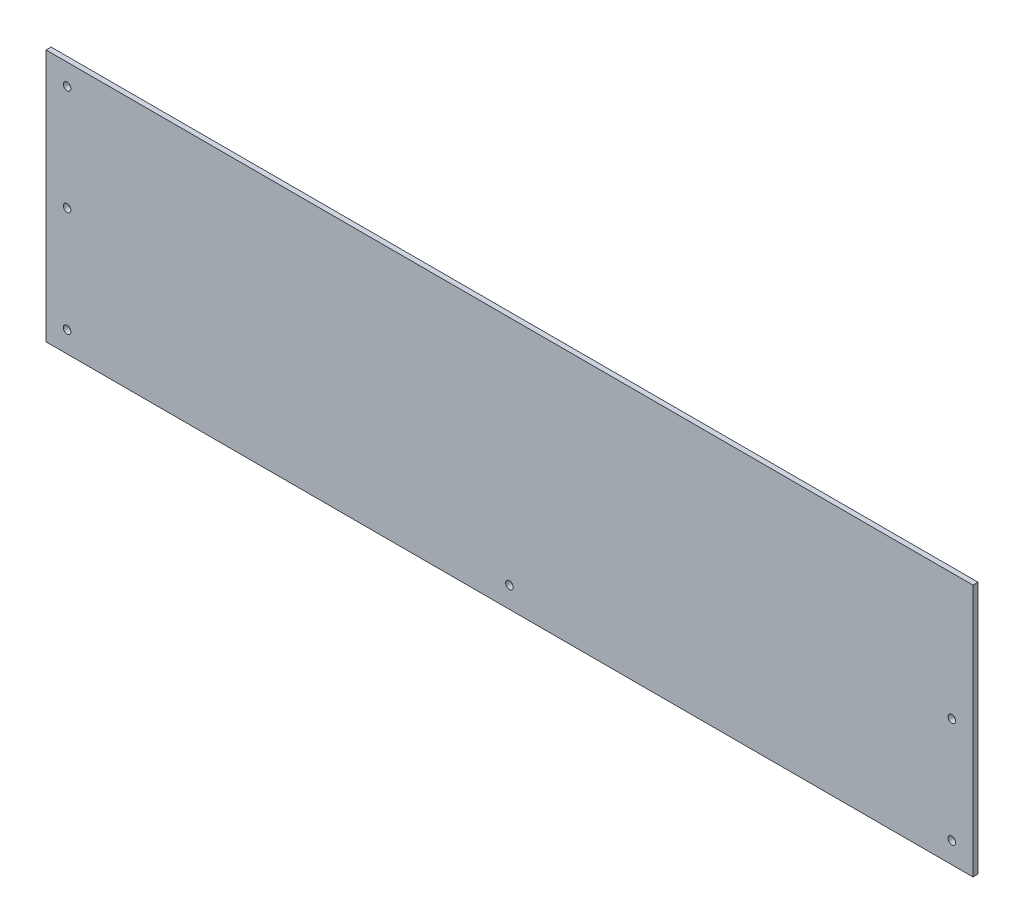
ISO-10303-21;
HEADER;
FILE_DESCRIPTION(('STEP AP214'),'2;1');
FILE_NAME('part.step','',(''),(''),'','','');
FILE_SCHEMA(('AUTOMOTIVE_DESIGN { 1 0 10303 214 1 1 1 1 }'));
ENDSEC;
DATA;
#1=APPLICATION_CONTEXT('core data for automotive mechanical design processes');
#2=APPLICATION_PROTOCOL_DEFINITION('international standard','automotive_design',2000,#1);
#3=PRODUCT_CONTEXT('',#1,'mechanical');
#4=PRODUCT('Part','Part','',(#3));
#5=PRODUCT_RELATED_PRODUCT_CATEGORY('part','',(#4));
#6=PRODUCT_DEFINITION_FORMATION('','',#4);
#7=PRODUCT_DEFINITION_CONTEXT('part definition',#1,'design');
#8=PRODUCT_DEFINITION('design','',#6,#7);
#9=PRODUCT_DEFINITION_SHAPE('','',#8);
#10=(LENGTH_UNIT() NAMED_UNIT(*) SI_UNIT(.MILLI.,.METRE.));
#11=(NAMED_UNIT(*) PLANE_ANGLE_UNIT() SI_UNIT($,.RADIAN.));
#12=(NAMED_UNIT(*) SI_UNIT($,.STERADIAN.) SOLID_ANGLE_UNIT());
#13=UNCERTAINTY_MEASURE_WITH_UNIT(LENGTH_MEASURE(1.E-05),#10,'distance_accuracy_value','');
#14=(GEOMETRIC_REPRESENTATION_CONTEXT(3) GLOBAL_UNCERTAINTY_ASSIGNED_CONTEXT((#13)) GLOBAL_UNIT_ASSIGNED_CONTEXT((#10,
#11,#12)) REPRESENTATION_CONTEXT('',''));
#15=CARTESIAN_POINT('',(0.,0.,0.));
#16=DIRECTION('',(0.,0.,1.));
#17=DIRECTION('',(1.,0.,0.));
#18=AXIS2_PLACEMENT_3D('',#15,#16,#17);
#19=CARTESIAN_POINT('',(0.,0.,3.));
#20=DIRECTION('',(1.,0.,0.));
#21=DIRECTION('',(0.,0.,-1.));
#22=AXIS2_PLACEMENT_3D('',#19,#20,#21);
#23=PLANE('',#22);
#24=DIRECTION('',(0.,-1.,0.));
#25=VECTOR('',#24,1.);
#26=CARTESIAN_POINT('',(0.,0.,0.));
#27=LINE('',#26,#25);
#28=CARTESIAN_POINT('',(0.,150.,0.));
#29=VERTEX_POINT('',#28);
#30=CARTESIAN_POINT('',(0.,0.,0.));
#31=VERTEX_POINT('',#30);
#32=EDGE_CURVE('E96',#29,#31,#27,.T.);
#33=ORIENTED_EDGE('',*,*,#32,.T.);
#34=DIRECTION('',(0.,0.,-1.));
#35=VECTOR('',#34,1.);
#36=CARTESIAN_POINT('',(0.,0.,3.));
#37=LINE('',#36,#35);
#38=CARTESIAN_POINT('',(0.,0.,3.));
#39=VERTEX_POINT('',#38);
#40=EDGE_CURVE('E11',#39,#31,#37,.T.);
#41=ORIENTED_EDGE('',*,*,#40,.F.);
#42=DIRECTION('',(0.,-1.,0.));
#43=VECTOR('',#42,1.);
#44=CARTESIAN_POINT('',(0.,0.,3.));
#45=LINE('',#44,#43);
#46=CARTESIAN_POINT('',(0.,150.,3.));
#47=VERTEX_POINT('',#46);
#48=EDGE_CURVE('E84',#47,#39,#45,.T.);
#49=ORIENTED_EDGE('',*,*,#48,.F.);
#50=DIRECTION('',(0.,0.,-1.));
#51=VECTOR('',#50,1.);
#52=CARTESIAN_POINT('',(0.,150.,3.));
#53=LINE('',#52,#51);
#54=EDGE_CURVE('E92',#47,#29,#53,.T.);
#55=ORIENTED_EDGE('',*,*,#54,.T.);
#56=EDGE_LOOP('',(#33,#41,#49,#55));
#57=FACE_BOUND('',#56,.T.);
#58=ADVANCED_FACE('F33',(#57),#23,.F.);
#59=CARTESIAN_POINT('',(0.,0.,3.));
#60=DIRECTION('',(0.,1.,0.));
#61=DIRECTION('',(0.,0.,1.));
#62=AXIS2_PLACEMENT_3D('',#59,#60,#61);
#63=PLANE('',#62);
#64=DIRECTION('',(1.,0.,0.));
#65=VECTOR('',#64,1.);
#66=CARTESIAN_POINT('',(0.,0.,0.));
#67=LINE('',#66,#65);
#68=CARTESIAN_POINT('',(550.000000000009,0.,0.));
#69=VERTEX_POINT('',#68);
#70=EDGE_CURVE('E88',#31,#69,#67,.T.);
#71=ORIENTED_EDGE('',*,*,#70,.T.);
#72=DIRECTION('',(0.,0.,-1.));
#73=VECTOR('',#72,1.);
#74=CARTESIAN_POINT('',(550.000000000009,0.,3.));
#75=LINE('',#74,#73);
#76=CARTESIAN_POINT('',(550.000000000009,0.,3.));
#77=VERTEX_POINT('',#76);
#78=EDGE_CURVE('E41',#77,#69,#75,.T.);
#79=ORIENTED_EDGE('',*,*,#78,.F.);
#80=DIRECTION('',(1.,0.,0.));
#81=VECTOR('',#80,1.);
#82=CARTESIAN_POINT('',(0.,0.,3.));
#83=LINE('',#82,#81);
#84=EDGE_CURVE('E79',#39,#77,#83,.T.);
#85=ORIENTED_EDGE('',*,*,#84,.F.);
#86=ORIENTED_EDGE('',*,*,#40,.T.);
#87=EDGE_LOOP('',(#71,#79,#85,#86));
#88=FACE_BOUND('',#87,.T.);
#89=ADVANCED_FACE('F87',(#88),#63,.F.);
#90=CARTESIAN_POINT('',(550.000000000009,0.,3.));
#91=DIRECTION('',(-1.,0.,0.));
#92=DIRECTION('',(0.,0.,1.));
#93=AXIS2_PLACEMENT_3D('',#90,#91,#92);
#94=PLANE('',#93);
#95=DIRECTION('',(0.,1.,0.));
#96=VECTOR('',#95,1.);
#97=CARTESIAN_POINT('',(550.000000000009,0.,0.));
#98=LINE('',#97,#96);
#99=CARTESIAN_POINT('',(550.000000000009,150.,0.));
#100=VERTEX_POINT('',#99);
#101=EDGE_CURVE('E66',#69,#100,#98,.T.);
#102=ORIENTED_EDGE('',*,*,#101,.T.);
#103=DIRECTION('',(0.,0.,-1.));
#104=VECTOR('',#103,1.);
#105=CARTESIAN_POINT('',(550.000000000009,150.,3.));
#106=LINE('',#105,#104);
#107=CARTESIAN_POINT('',(550.000000000009,150.,3.));
#108=VERTEX_POINT('',#107);
#109=EDGE_CURVE('E89',#108,#100,#106,.T.);
#110=ORIENTED_EDGE('',*,*,#109,.F.);
#111=DIRECTION('',(0.,1.,0.));
#112=VECTOR('',#111,1.);
#113=CARTESIAN_POINT('',(550.000000000009,0.,3.));
#114=LINE('',#113,#112);
#115=EDGE_CURVE('E82',#77,#108,#114,.T.);
#116=ORIENTED_EDGE('',*,*,#115,.F.);
#117=ORIENTED_EDGE('',*,*,#78,.T.);
#118=EDGE_LOOP('',(#102,#110,#116,#117));
#119=FACE_BOUND('',#118,.T.);
#120=ADVANCED_FACE('F90',(#119),#94,.F.);
#121=CARTESIAN_POINT('',(0.,150.,3.));
#122=DIRECTION('',(0.,-1.,0.));
#123=DIRECTION('',(0.,0.,-1.));
#124=AXIS2_PLACEMENT_3D('',#121,#122,#123);
#125=PLANE('',#124);
#126=DIRECTION('',(-1.,0.,0.));
#127=VECTOR('',#126,1.);
#128=CARTESIAN_POINT('',(0.,150.,0.));
#129=LINE('',#128,#127);
#130=EDGE_CURVE('E72',#100,#29,#129,.T.);
#131=ORIENTED_EDGE('',*,*,#130,.T.);
#132=ORIENTED_EDGE('',*,*,#54,.F.);
#133=DIRECTION('',(-1.,0.,0.));
#134=VECTOR('',#133,1.);
#135=CARTESIAN_POINT('',(0.,150.,3.));
#136=LINE('',#135,#134);
#137=EDGE_CURVE('E49',#108,#47,#136,.T.);
#138=ORIENTED_EDGE('',*,*,#137,.F.);
#139=ORIENTED_EDGE('',*,*,#109,.T.);
#140=EDGE_LOOP('',(#131,#132,#138,#139));
#141=FACE_BOUND('',#140,.T.);
#142=ADVANCED_FACE('F104',(#141),#125,.F.);
#143=CARTESIAN_POINT('',(0.,0.,3.));
#144=DIRECTION('',(0.,0.,-1.));
#145=DIRECTION('',(-1.,0.,0.));
#146=AXIS2_PLACEMENT_3D('',#143,#144,#145);
#147=PLANE('',#146);
#148=CARTESIAN_POINT('',(12.5,75.,3.));
#149=DIRECTION('',(0.,0.,1.));
#150=DIRECTION('',(1.,0.,0.));
#151=AXIS2_PLACEMENT_3D('',#148,#149,#150);
#152=CIRCLE('',#151,2.25);
#153=CARTESIAN_POINT('',(14.75,75.,3.));
#154=VERTEX_POINT('',#153);
#155=EDGE_CURVE('E142',#154,#154,#152,.T.);
#156=ORIENTED_EDGE('',*,*,#155,.F.);
#157=EDGE_LOOP('',(#156));
#158=FACE_BOUND('',#157,.T.);
#159=CARTESIAN_POINT('',(12.5,137.5,3.));
#160=DIRECTION('',(0.,0.,1.));
#161=DIRECTION('',(1.,0.,0.));
#162=AXIS2_PLACEMENT_3D('',#159,#160,#161);
#163=CIRCLE('',#162,2.25);
#164=CARTESIAN_POINT('',(14.75,137.5,3.));
#165=VERTEX_POINT('',#164);
#166=EDGE_CURVE('E136',#165,#165,#163,.T.);
#167=ORIENTED_EDGE('',*,*,#166,.F.);
#168=EDGE_LOOP('',(#167));
#169=FACE_BOUND('',#168,.T.);
#170=CARTESIAN_POINT('',(12.5,12.5,3.));
#171=DIRECTION('',(0.,0.,1.));
#172=DIRECTION('',(1.,0.,0.));
#173=AXIS2_PLACEMENT_3D('',#170,#171,#172);
#174=CIRCLE('',#173,2.25);
#175=CARTESIAN_POINT('',(14.75,12.5,3.));
#176=VERTEX_POINT('',#175);
#177=EDGE_CURVE('E130',#176,#176,#174,.T.);
#178=ORIENTED_EDGE('',*,*,#177,.F.);
#179=EDGE_LOOP('',(#178));
#180=FACE_BOUND('',#179,.T.);
#181=CARTESIAN_POINT('',(275.000000000004,12.5,3.));
#182=DIRECTION('',(0.,0.,1.));
#183=DIRECTION('',(1.,0.,0.));
#184=AXIS2_PLACEMENT_3D('',#181,#182,#183);
#185=CIRCLE('',#184,2.24999999999997);
#186=CARTESIAN_POINT('',(277.250000000004,12.5,3.));
#187=VERTEX_POINT('',#186);
#188=EDGE_CURVE('E124',#187,#187,#185,.T.);
#189=ORIENTED_EDGE('',*,*,#188,.F.);
#190=EDGE_LOOP('',(#189));
#191=FACE_BOUND('',#190,.T.);
#192=CARTESIAN_POINT('',(537.500000000009,12.5,3.));
#193=DIRECTION('',(0.,0.,1.));
#194=DIRECTION('',(1.,0.,0.));
#195=AXIS2_PLACEMENT_3D('',#192,#193,#194);
#196=CIRCLE('',#195,2.24999999999997);
#197=CARTESIAN_POINT('',(539.750000000009,12.5,3.));
#198=VERTEX_POINT('',#197);
#199=EDGE_CURVE('E118',#198,#198,#196,.T.);
#200=ORIENTED_EDGE('',*,*,#199,.F.);
#201=EDGE_LOOP('',(#200));
#202=FACE_BOUND('',#201,.T.);
#203=CARTESIAN_POINT('',(537.500000000009,75.,3.));
#204=DIRECTION('',(0.,0.,1.));
#205=DIRECTION('',(1.,0.,0.));
#206=AXIS2_PLACEMENT_3D('',#203,#204,#205);
#207=CIRCLE('',#206,2.24999999999997);
#208=CARTESIAN_POINT('',(539.750000000009,75.,3.));
#209=VERTEX_POINT('',#208);
#210=EDGE_CURVE('E112',#209,#209,#207,.T.);
#211=ORIENTED_EDGE('',*,*,#210,.F.);
#212=EDGE_LOOP('',(#211));
#213=FACE_BOUND('',#212,.T.);
#214=ORIENTED_EDGE('',*,*,#48,.T.);
#215=ORIENTED_EDGE('',*,*,#84,.T.);
#216=ORIENTED_EDGE('',*,*,#115,.T.);
#217=ORIENTED_EDGE('',*,*,#137,.T.);
#218=EDGE_LOOP('',(#214,#215,#216,#217));
#219=FACE_BOUND('',#218,.T.);
#220=ADVANCED_FACE('F80',(#158,#169,#180,#191,#202,#213,#219),#147,.F.);
#221=CARTESIAN_POINT('',(0.,0.,0.));
#222=DIRECTION('',(0.,0.,-1.));
#223=DIRECTION('',(-1.,0.,0.));
#224=AXIS2_PLACEMENT_3D('',#221,#222,#223);
#225=PLANE('',#224);
#226=CARTESIAN_POINT('',(12.5,75.,0.));
#227=DIRECTION('',(0.,0.,1.));
#228=DIRECTION('',(1.,0.,0.));
#229=AXIS2_PLACEMENT_3D('',#226,#227,#228);
#230=CIRCLE('',#229,2.25);
#231=CARTESIAN_POINT('',(14.75,75.,0.));
#232=VERTEX_POINT('',#231);
#233=EDGE_CURVE('E139',#232,#232,#230,.T.);
#234=ORIENTED_EDGE('',*,*,#233,.T.);
#235=EDGE_LOOP('',(#234));
#236=FACE_BOUND('',#235,.T.);
#237=CARTESIAN_POINT('',(12.5,137.5,0.));
#238=DIRECTION('',(0.,0.,1.));
#239=DIRECTION('',(1.,0.,0.));
#240=AXIS2_PLACEMENT_3D('',#237,#238,#239);
#241=CIRCLE('',#240,2.25);
#242=CARTESIAN_POINT('',(14.75,137.5,0.));
#243=VERTEX_POINT('',#242);
#244=EDGE_CURVE('E133',#243,#243,#241,.T.);
#245=ORIENTED_EDGE('',*,*,#244,.T.);
#246=EDGE_LOOP('',(#245));
#247=FACE_BOUND('',#246,.T.);
#248=CARTESIAN_POINT('',(12.5,12.5,0.));
#249=DIRECTION('',(0.,0.,1.));
#250=DIRECTION('',(1.,0.,0.));
#251=AXIS2_PLACEMENT_3D('',#248,#249,#250);
#252=CIRCLE('',#251,2.25);
#253=CARTESIAN_POINT('',(14.75,12.5,0.));
#254=VERTEX_POINT('',#253);
#255=EDGE_CURVE('E127',#254,#254,#252,.T.);
#256=ORIENTED_EDGE('',*,*,#255,.T.);
#257=EDGE_LOOP('',(#256));
#258=FACE_BOUND('',#257,.T.);
#259=CARTESIAN_POINT('',(275.000000000004,12.5,0.));
#260=DIRECTION('',(0.,0.,1.));
#261=DIRECTION('',(1.,0.,0.));
#262=AXIS2_PLACEMENT_3D('',#259,#260,#261);
#263=CIRCLE('',#262,2.24999999999997);
#264=CARTESIAN_POINT('',(277.250000000004,12.5,0.));
#265=VERTEX_POINT('',#264);
#266=EDGE_CURVE('E121',#265,#265,#263,.T.);
#267=ORIENTED_EDGE('',*,*,#266,.T.);
#268=EDGE_LOOP('',(#267));
#269=FACE_BOUND('',#268,.T.);
#270=CARTESIAN_POINT('',(537.500000000009,12.5,0.));
#271=DIRECTION('',(0.,0.,1.));
#272=DIRECTION('',(1.,0.,0.));
#273=AXIS2_PLACEMENT_3D('',#270,#271,#272);
#274=CIRCLE('',#273,2.24999999999997);
#275=CARTESIAN_POINT('',(539.750000000009,12.5,0.));
#276=VERTEX_POINT('',#275);
#277=EDGE_CURVE('E115',#276,#276,#274,.T.);
#278=ORIENTED_EDGE('',*,*,#277,.T.);
#279=EDGE_LOOP('',(#278));
#280=FACE_BOUND('',#279,.T.);
#281=CARTESIAN_POINT('',(537.500000000009,75.,0.));
#282=DIRECTION('',(0.,0.,1.));
#283=DIRECTION('',(1.,0.,0.));
#284=AXIS2_PLACEMENT_3D('',#281,#282,#283);
#285=CIRCLE('',#284,2.24999999999997);
#286=CARTESIAN_POINT('',(539.750000000009,75.,0.));
#287=VERTEX_POINT('',#286);
#288=EDGE_CURVE('E99',#287,#287,#285,.T.);
#289=ORIENTED_EDGE('',*,*,#288,.T.);
#290=EDGE_LOOP('',(#289));
#291=FACE_BOUND('',#290,.T.);
#292=ORIENTED_EDGE('',*,*,#32,.F.);
#293=ORIENTED_EDGE('',*,*,#130,.F.);
#294=ORIENTED_EDGE('',*,*,#101,.F.);
#295=ORIENTED_EDGE('',*,*,#70,.F.);
#296=EDGE_LOOP('',(#292,#293,#294,#295));
#297=FACE_BOUND('',#296,.T.);
#298=ADVANCED_FACE('F107',(#236,#247,#258,#269,#280,#291,#297),#225,.T.);
#299=CARTESIAN_POINT('',(537.500000000009,75.,3.));
#300=DIRECTION('',(0.,0.,1.));
#301=DIRECTION('',(1.,0.,0.));
#302=AXIS2_PLACEMENT_3D('',#299,#300,#301);
#303=CYLINDRICAL_SURFACE('',#302,2.24999999999997);
#304=ORIENTED_EDGE('',*,*,#288,.F.);
#305=EDGE_LOOP('',(#304));
#306=FACE_BOUND('',#305,.T.);
#307=ORIENTED_EDGE('',*,*,#210,.T.);
#308=EDGE_LOOP('',(#307));
#309=FACE_BOUND('',#308,.T.);
#310=ADVANCED_FACE('F161',(#306,#309),#303,.F.);
#311=CARTESIAN_POINT('',(537.500000000009,12.5,3.));
#312=DIRECTION('',(0.,0.,1.));
#313=DIRECTION('',(1.,0.,0.));
#314=AXIS2_PLACEMENT_3D('',#311,#312,#313);
#315=CYLINDRICAL_SURFACE('',#314,2.24999999999997);
#316=ORIENTED_EDGE('',*,*,#277,.F.);
#317=EDGE_LOOP('',(#316));
#318=FACE_BOUND('',#317,.T.);
#319=ORIENTED_EDGE('',*,*,#199,.T.);
#320=EDGE_LOOP('',(#319));
#321=FACE_BOUND('',#320,.T.);
#322=ADVANCED_FACE('F163',(#318,#321),#315,.F.);
#323=CARTESIAN_POINT('',(275.000000000004,12.5,3.));
#324=DIRECTION('',(0.,0.,1.));
#325=DIRECTION('',(1.,0.,0.));
#326=AXIS2_PLACEMENT_3D('',#323,#324,#325);
#327=CYLINDRICAL_SURFACE('',#326,2.24999999999997);
#328=ORIENTED_EDGE('',*,*,#266,.F.);
#329=EDGE_LOOP('',(#328));
#330=FACE_BOUND('',#329,.T.);
#331=ORIENTED_EDGE('',*,*,#188,.T.);
#332=EDGE_LOOP('',(#331));
#333=FACE_BOUND('',#332,.T.);
#334=ADVANCED_FACE('F170',(#330,#333),#327,.F.);
#335=CARTESIAN_POINT('',(12.5,12.5,3.));
#336=DIRECTION('',(0.,0.,1.));
#337=DIRECTION('',(1.,0.,0.));
#338=AXIS2_PLACEMENT_3D('',#335,#336,#337);
#339=CYLINDRICAL_SURFACE('',#338,2.25);
#340=ORIENTED_EDGE('',*,*,#255,.F.);
#341=EDGE_LOOP('',(#340));
#342=FACE_BOUND('',#341,.T.);
#343=ORIENTED_EDGE('',*,*,#177,.T.);
#344=EDGE_LOOP('',(#343));
#345=FACE_BOUND('',#344,.T.);
#346=ADVANCED_FACE('F217',(#342,#345),#339,.F.);
#347=CARTESIAN_POINT('',(12.5,137.5,3.));
#348=DIRECTION('',(0.,0.,1.));
#349=DIRECTION('',(1.,0.,0.));
#350=AXIS2_PLACEMENT_3D('',#347,#348,#349);
#351=CYLINDRICAL_SURFACE('',#350,2.25);
#352=ORIENTED_EDGE('',*,*,#244,.F.);
#353=EDGE_LOOP('',(#352));
#354=FACE_BOUND('',#353,.T.);
#355=ORIENTED_EDGE('',*,*,#166,.T.);
#356=EDGE_LOOP('',(#355));
#357=FACE_BOUND('',#356,.T.);
#358=ADVANCED_FACE('F227',(#354,#357),#351,.F.);
#359=CARTESIAN_POINT('',(12.5,75.,3.));
#360=DIRECTION('',(0.,0.,1.));
#361=DIRECTION('',(1.,0.,0.));
#362=AXIS2_PLACEMENT_3D('',#359,#360,#361);
#363=CYLINDRICAL_SURFACE('',#362,2.25);
#364=ORIENTED_EDGE('',*,*,#233,.F.);
#365=EDGE_LOOP('',(#364));
#366=FACE_BOUND('',#365,.T.);
#367=ORIENTED_EDGE('',*,*,#155,.T.);
#368=EDGE_LOOP('',(#367));
#369=FACE_BOUND('',#368,.T.);
#370=ADVANCED_FACE('F146',(#366,#369),#363,.F.);
#371=CLOSED_SHELL('',(#58,#89,#120,#142,#220,#298,#310,#322,#334,#346,#358,#370));
#372=MANIFOLD_SOLID_BREP('B2',#371);
#373=ADVANCED_BREP_SHAPE_REPRESENTATION('',(#18,#372),#14);
#374=SHAPE_DEFINITION_REPRESENTATION(#9,#373);
ENDSEC;
END-ISO-10303-21;
